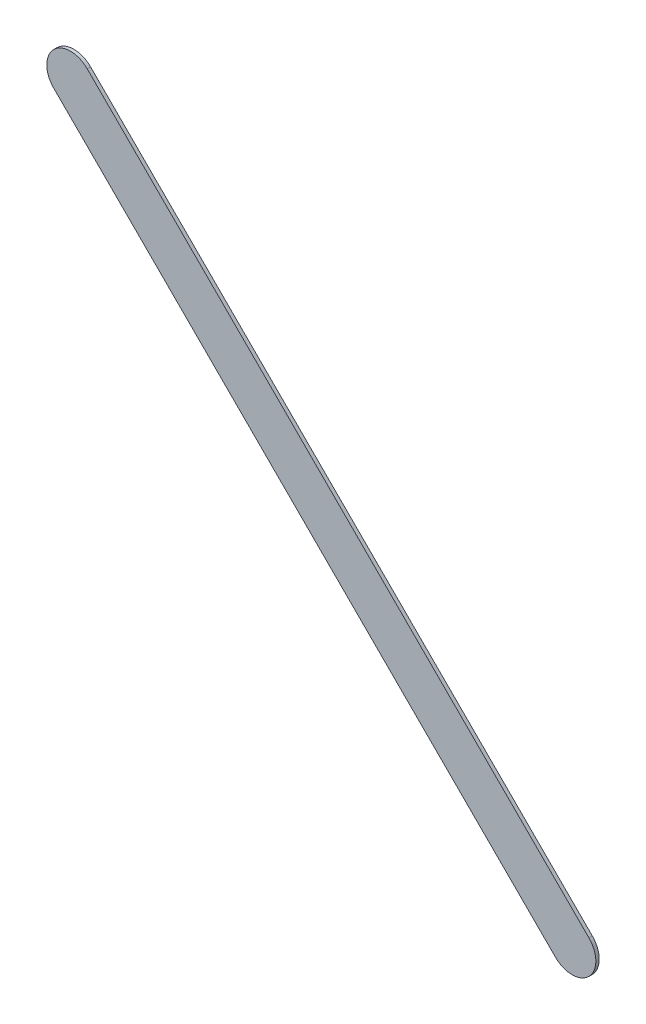
ISO-10303-21;
HEADER;
FILE_DESCRIPTION(('STEP AP214'),'2;1');
FILE_NAME('part.step','',(''),(''),'','','');
FILE_SCHEMA(('AUTOMOTIVE_DESIGN { 1 0 10303 214 1 1 1 1 }'));
ENDSEC;
DATA;
#1=APPLICATION_CONTEXT('core data for automotive mechanical design processes');
#2=APPLICATION_PROTOCOL_DEFINITION('international standard','automotive_design',2000,#1);
#3=PRODUCT_CONTEXT('',#1,'mechanical');
#4=PRODUCT('Part','Part','',(#3));
#5=PRODUCT_RELATED_PRODUCT_CATEGORY('part','',(#4));
#6=PRODUCT_DEFINITION_FORMATION('','',#4);
#7=PRODUCT_DEFINITION_CONTEXT('part definition',#1,'design');
#8=PRODUCT_DEFINITION('design','',#6,#7);
#9=PRODUCT_DEFINITION_SHAPE('','',#8);
#10=(LENGTH_UNIT() NAMED_UNIT(*) SI_UNIT(.MILLI.,.METRE.));
#11=(NAMED_UNIT(*) PLANE_ANGLE_UNIT() SI_UNIT($,.RADIAN.));
#12=(NAMED_UNIT(*) SI_UNIT($,.STERADIAN.) SOLID_ANGLE_UNIT());
#13=UNCERTAINTY_MEASURE_WITH_UNIT(LENGTH_MEASURE(1.E-05),#10,'distance_accuracy_value','');
#14=(GEOMETRIC_REPRESENTATION_CONTEXT(3) GLOBAL_UNCERTAINTY_ASSIGNED_CONTEXT((#13)) GLOBAL_UNIT_ASSIGNED_CONTEXT((#10,
#11,#12)) REPRESENTATION_CONTEXT('',''));
#15=CARTESIAN_POINT('',(0.,0.,0.));
#16=DIRECTION('',(0.,0.,1.));
#17=DIRECTION('',(1.,0.,0.));
#18=AXIS2_PLACEMENT_3D('',#15,#16,#17);
#19=CARTESIAN_POINT('',(95.42723866,101.11920848,0.));
#20=DIRECTION('',(0.707106781186549,0.707106781186547,0.));
#21=DIRECTION('',(0.707106781186547,-0.707106781186549,0.));
#22=AXIS2_PLACEMENT_3D('',#19,#20,#21);
#23=PLANE('',#22);
#24=DIRECTION('',(0.707106781186547,-0.707106781186549,0.));
#25=VECTOR('',#24,1.);
#26=CARTESIAN_POINT('',(95.42723866,101.11920848,0.03556));
#27=LINE('',#26,#25);
#28=CARTESIAN_POINT('',(95.42723866,101.11920848,0.03556));
#29=VERTEX_POINT('',#28);
#30=CARTESIAN_POINT('',(100.72322248,95.82322466,0.03556));
#31=VERTEX_POINT('',#30);
#32=EDGE_CURVE('E11',#29,#31,#27,.T.);
#33=ORIENTED_EDGE('',*,*,#32,.F.);
#34=DIRECTION('',(0.,0.,1.));
#35=VECTOR('',#34,1.);
#36=CARTESIAN_POINT('',(95.42723866,101.11920848,0.));
#37=LINE('',#36,#35);
#38=CARTESIAN_POINT('',(95.42723866,101.11920848,0.));
#39=VERTEX_POINT('',#38);
#40=EDGE_CURVE('E24',#39,#29,#37,.T.);
#41=ORIENTED_EDGE('',*,*,#40,.F.);
#42=DIRECTION('',(0.707106781186547,-0.707106781186549,0.));
#43=VECTOR('',#42,1.);
#44=CARTESIAN_POINT('',(95.42723866,101.11920848,0.));
#45=LINE('',#44,#43);
#46=CARTESIAN_POINT('',(100.72322248,95.82322466,0.));
#47=VERTEX_POINT('',#46);
#48=EDGE_CURVE('E75',#39,#47,#45,.T.);
#49=ORIENTED_EDGE('',*,*,#48,.T.);
#50=DIRECTION('',(0.,0.,1.));
#51=VECTOR('',#50,1.);
#52=CARTESIAN_POINT('',(100.72322248,95.82322466,0.));
#53=LINE('',#52,#51);
#54=EDGE_CURVE('E37',#47,#31,#53,.T.);
#55=ORIENTED_EDGE('',*,*,#54,.T.);
#56=EDGE_LOOP('',(#33,#41,#49,#55));
#57=FACE_BOUND('',#56,.T.);
#58=ADVANCED_FACE('F17',(#57),#23,.F.);
#59=CARTESIAN_POINT('',(100.89999886,96.00000104,0.));
#60=DIRECTION('',(0.,0.,-1.));
#61=DIRECTION('',(-0.707106781186548,-0.707106781186548,0.));
#62=AXIS2_PLACEMENT_3D('',#59,#60,#61);
#63=CYLINDRICAL_SURFACE('',#62,0.249999554103226);
#64=CARTESIAN_POINT('',(100.89999886,96.00000104,0.03556));
#65=DIRECTION('',(0.,0.,1.));
#66=DIRECTION('',(-0.707106781186548,-0.707106781186548,0.));
#67=AXIS2_PLACEMENT_3D('',#64,#65,#66);
#68=CIRCLE('',#67,0.249999554103226);
#69=CARTESIAN_POINT('',(101.07677524,96.17677742,0.03556));
#70=VERTEX_POINT('',#69);
#71=EDGE_CURVE('E83',#31,#70,#68,.T.);
#72=ORIENTED_EDGE('',*,*,#71,.F.);
#73=ORIENTED_EDGE('',*,*,#54,.F.);
#74=CARTESIAN_POINT('',(100.89999886,96.00000104,0.));
#75=DIRECTION('',(0.,0.,1.));
#76=DIRECTION('',(-0.707106781186548,-0.707106781186548,0.));
#77=AXIS2_PLACEMENT_3D('',#74,#75,#76);
#78=CIRCLE('',#77,0.249999554103226);
#79=CARTESIAN_POINT('',(101.07677524,96.17677742,0.));
#80=VERTEX_POINT('',#79);
#81=EDGE_CURVE('E81',#47,#80,#78,.T.);
#82=ORIENTED_EDGE('',*,*,#81,.T.);
#83=DIRECTION('',(0.,0.,1.));
#84=VECTOR('',#83,1.);
#85=CARTESIAN_POINT('',(101.07677524,96.17677742,0.));
#86=LINE('',#85,#84);
#87=EDGE_CURVE('E67',#80,#70,#86,.T.);
#88=ORIENTED_EDGE('',*,*,#87,.T.);
#89=EDGE_LOOP('',(#72,#73,#82,#88));
#90=FACE_BOUND('',#89,.T.);
#91=ADVANCED_FACE('F89',(#90),#63,.T.);
#92=CARTESIAN_POINT('',(101.07677524,96.17677742,0.));
#93=DIRECTION('',(-0.707106781186548,-0.707106781186548,0.));
#94=DIRECTION('',(-0.707106781186548,0.707106781186548,0.));
#95=AXIS2_PLACEMENT_3D('',#92,#93,#94);
#96=PLANE('',#95);
#97=DIRECTION('',(-0.707106781186548,0.707106781186548,0.));
#98=VECTOR('',#97,1.);
#99=CARTESIAN_POINT('',(101.07677524,96.17677742,0.03556));
#100=LINE('',#99,#98);
#101=CARTESIAN_POINT('',(95.78079142,101.47276124,0.03556));
#102=VERTEX_POINT('',#101);
#103=EDGE_CURVE('E71',#70,#102,#100,.T.);
#104=ORIENTED_EDGE('',*,*,#103,.F.);
#105=ORIENTED_EDGE('',*,*,#87,.F.);
#106=DIRECTION('',(-0.707106781186548,0.707106781186548,0.));
#107=VECTOR('',#106,1.);
#108=CARTESIAN_POINT('',(101.07677524,96.17677742,0.));
#109=LINE('',#108,#107);
#110=CARTESIAN_POINT('',(95.78079142,101.47276124,0.));
#111=VERTEX_POINT('',#110);
#112=EDGE_CURVE('E63',#80,#111,#109,.T.);
#113=ORIENTED_EDGE('',*,*,#112,.T.);
#114=DIRECTION('',(0.,0.,1.));
#115=VECTOR('',#114,1.);
#116=CARTESIAN_POINT('',(95.78079142,101.47276124,0.));
#117=LINE('',#116,#115);
#118=EDGE_CURVE('E53',#111,#102,#117,.T.);
#119=ORIENTED_EDGE('',*,*,#118,.T.);
#120=EDGE_LOOP('',(#104,#105,#113,#119));
#121=FACE_BOUND('',#120,.T.);
#122=ADVANCED_FACE('F66',(#121),#96,.F.);
#123=CARTESIAN_POINT('',(95.60401504,101.29598486,0.));
#124=DIRECTION('',(0.,0.,-1.));
#125=DIRECTION('',(0.707106781186548,0.707106781186548,0.));
#126=AXIS2_PLACEMENT_3D('',#123,#124,#125);
#127=CYLINDRICAL_SURFACE('',#126,0.24999955410322);
#128=CARTESIAN_POINT('',(95.60401504,101.29598486,0.03556));
#129=DIRECTION('',(0.,0.,1.));
#130=DIRECTION('',(0.707106781186548,0.707106781186548,0.));
#131=AXIS2_PLACEMENT_3D('',#128,#129,#130);
#132=CIRCLE('',#131,0.24999955410322);
#133=EDGE_CURVE('E59',#102,#29,#132,.T.);
#134=ORIENTED_EDGE('',*,*,#133,.F.);
#135=ORIENTED_EDGE('',*,*,#118,.F.);
#136=CARTESIAN_POINT('',(95.60401504,101.29598486,0.));
#137=DIRECTION('',(0.,0.,1.));
#138=DIRECTION('',(0.707106781186548,0.707106781186548,0.));
#139=AXIS2_PLACEMENT_3D('',#136,#137,#138);
#140=CIRCLE('',#139,0.24999955410322);
#141=EDGE_CURVE('E57',#111,#39,#140,.T.);
#142=ORIENTED_EDGE('',*,*,#141,.T.);
#143=ORIENTED_EDGE('',*,*,#40,.T.);
#144=EDGE_LOOP('',(#134,#135,#142,#143));
#145=FACE_BOUND('',#144,.T.);
#146=ADVANCED_FACE('F55',(#145),#127,.T.);
#147=CARTESIAN_POINT('',(95.42723866,101.11920848,0.));
#148=DIRECTION('',(0.,0.,-1.));
#149=DIRECTION('',(-1.,0.,0.));
#150=AXIS2_PLACEMENT_3D('',#147,#148,#149);
#151=PLANE('',#150);
#152=ORIENTED_EDGE('',*,*,#141,.F.);
#153=ORIENTED_EDGE('',*,*,#112,.F.);
#154=ORIENTED_EDGE('',*,*,#81,.F.);
#155=ORIENTED_EDGE('',*,*,#48,.F.);
#156=EDGE_LOOP('',(#152,#153,#154,#155));
#157=FACE_BOUND('',#156,.T.);
#158=ADVANCED_FACE('F74',(#157),#151,.T.);
#159=CARTESIAN_POINT('',(95.42723866,101.11920848,0.03556));
#160=DIRECTION('',(0.,0.,-1.));
#161=DIRECTION('',(-1.,0.,0.));
#162=AXIS2_PLACEMENT_3D('',#159,#160,#161);
#163=PLANE('',#162);
#164=ORIENTED_EDGE('',*,*,#32,.T.);
#165=ORIENTED_EDGE('',*,*,#71,.T.);
#166=ORIENTED_EDGE('',*,*,#103,.T.);
#167=ORIENTED_EDGE('',*,*,#133,.T.);
#168=EDGE_LOOP('',(#164,#165,#166,#167));
#169=FACE_BOUND('',#168,.T.);
#170=ADVANCED_FACE('F91',(#169),#163,.F.);
#171=CLOSED_SHELL('',(#58,#91,#122,#146,#158,#170));
#172=MANIFOLD_SOLID_BREP('B1',#171);
#173=ADVANCED_BREP_SHAPE_REPRESENTATION('',(#18,#172),#14);
#174=SHAPE_DEFINITION_REPRESENTATION(#9,#173);
ENDSEC;
END-ISO-10303-21;
